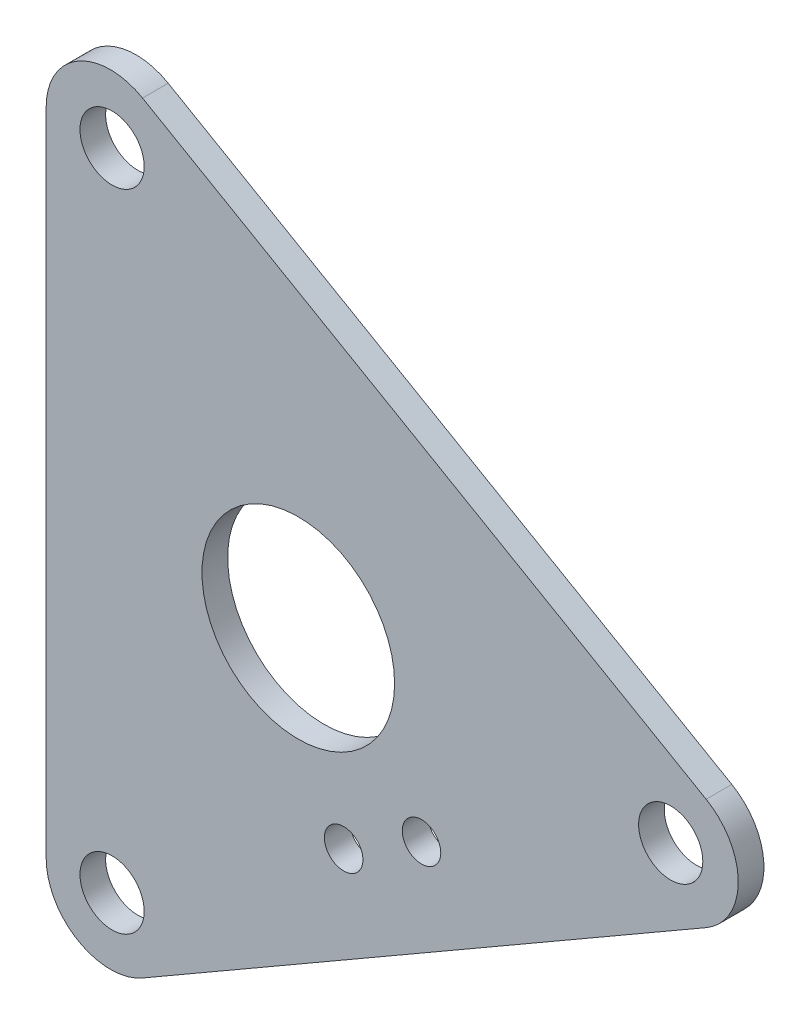
ISO-10303-21;
HEADER;
FILE_DESCRIPTION(('STEP AP214'),'2;1');
FILE_NAME('part.step','',(''),(''),'','','');
FILE_SCHEMA(('AUTOMOTIVE_DESIGN { 1 0 10303 214 1 1 1 1 }'));
ENDSEC;
DATA;
#1=APPLICATION_CONTEXT('core data for automotive mechanical design processes');
#2=APPLICATION_PROTOCOL_DEFINITION('international standard','automotive_design',2000,#1);
#3=PRODUCT_CONTEXT('',#1,'mechanical');
#4=PRODUCT('Part','Part','',(#3));
#5=PRODUCT_RELATED_PRODUCT_CATEGORY('part','',(#4));
#6=PRODUCT_DEFINITION_FORMATION('','',#4);
#7=PRODUCT_DEFINITION_CONTEXT('part definition',#1,'design');
#8=PRODUCT_DEFINITION('design','',#6,#7);
#9=PRODUCT_DEFINITION_SHAPE('','',#8);
#10=(LENGTH_UNIT() NAMED_UNIT(*) SI_UNIT(.MILLI.,.METRE.));
#11=(NAMED_UNIT(*) PLANE_ANGLE_UNIT() SI_UNIT($,.RADIAN.));
#12=(NAMED_UNIT(*) SI_UNIT($,.STERADIAN.) SOLID_ANGLE_UNIT());
#13=UNCERTAINTY_MEASURE_WITH_UNIT(LENGTH_MEASURE(1.E-05),#10,'distance_accuracy_value','');
#14=(GEOMETRIC_REPRESENTATION_CONTEXT(3) GLOBAL_UNCERTAINTY_ASSIGNED_CONTEXT((#13)) GLOBAL_UNIT_ASSIGNED_CONTEXT((#10,
#11,#12)) REPRESENTATION_CONTEXT('',''));
#15=CARTESIAN_POINT('',(0.,0.,0.));
#16=DIRECTION('',(0.,0.,1.));
#17=DIRECTION('',(1.,0.,0.));
#18=AXIS2_PLACEMENT_3D('',#15,#16,#17);
#19=CARTESIAN_POINT('',(-19.6299091524473,-34.,2.));
#20=DIRECTION('',(-0.5,0.866025403784439,0.));
#21=DIRECTION('',(-0.866025403784439,-0.5,0.));
#22=AXIS2_PLACEMENT_3D('',#19,#20,#21);
#23=PLANE('',#22);
#24=DIRECTION('',(0.866025403784439,0.5,0.));
#25=VECTOR('',#24,1.);
#26=CARTESIAN_POINT('',(-19.6299091524473,-34.,0.));
#27=LINE('',#26,#25);
#28=CARTESIAN_POINT('',(-12.1299091524473,-29.6698729810778,0.));
#29=VERTEX_POINT('',#28);
#30=CARTESIAN_POINT('',(31.7598183048945,-4.33012701892219,0.));
#31=VERTEX_POINT('',#30);
#32=EDGE_CURVE('E112',#29,#31,#27,.T.);
#33=ORIENTED_EDGE('',*,*,#32,.T.);
#34=DIRECTION('',(0.,0.,-1.));
#35=VECTOR('',#34,1.);
#36=CARTESIAN_POINT('',(31.7598183048945,-4.33012701892219,2.));
#37=LINE('',#36,#35);
#38=CARTESIAN_POINT('',(31.7598183048945,-4.33012701892219,2.));
#39=VERTEX_POINT('',#38);
#40=EDGE_CURVE('E91',#31,#39,#37,.F.);
#41=ORIENTED_EDGE('',*,*,#40,.T.);
#42=DIRECTION('',(0.866025403784439,0.5,0.));
#43=VECTOR('',#42,1.);
#44=CARTESIAN_POINT('',(-19.6299091524473,-34.,2.));
#45=LINE('',#44,#43);
#46=CARTESIAN_POINT('',(-12.1299091524473,-29.6698729810778,2.));
#47=VERTEX_POINT('',#46);
#48=EDGE_CURVE('E114',#47,#39,#45,.T.);
#49=ORIENTED_EDGE('',*,*,#48,.F.);
#50=DIRECTION('',(0.,0.,-1.));
#51=VECTOR('',#50,1.);
#52=CARTESIAN_POINT('',(-12.1299091524473,-29.6698729810778,2.));
#53=LINE('',#52,#51);
#54=EDGE_CURVE('E96',#47,#29,#53,.T.);
#55=ORIENTED_EDGE('',*,*,#54,.T.);
#56=EDGE_LOOP('',(#33,#41,#49,#55));
#57=FACE_BOUND('',#56,.T.);
#58=ADVANCED_FACE('F33',(#57),#23,.F.);
#59=CARTESIAN_POINT('',(39.2598183048945,0.,2.));
#60=DIRECTION('',(-0.5,-0.866025403784439,0.));
#61=DIRECTION('',(0.866025403784439,-0.5,0.));
#62=AXIS2_PLACEMENT_3D('',#59,#60,#61);
#63=PLANE('',#62);
#64=DIRECTION('',(-0.866025403784439,0.5,0.));
#65=VECTOR('',#64,1.);
#66=CARTESIAN_POINT('',(39.2598183048945,0.,2.));
#67=LINE('',#66,#65);
#68=CARTESIAN_POINT('',(31.7598183048945,4.33012701892219,2.));
#69=VERTEX_POINT('',#68);
#70=CARTESIAN_POINT('',(-12.1299091524473,29.6698729810778,2.));
#71=VERTEX_POINT('',#70);
#72=EDGE_CURVE('E105',#69,#71,#67,.T.);
#73=ORIENTED_EDGE('',*,*,#72,.F.);
#74=DIRECTION('',(0.,0.,-1.));
#75=VECTOR('',#74,1.);
#76=CARTESIAN_POINT('',(31.7598183048945,4.33012701892219,2.));
#77=LINE('',#76,#75);
#78=CARTESIAN_POINT('',(31.7598183048945,4.33012701892219,0.));
#79=VERTEX_POINT('',#78);
#80=EDGE_CURVE('E90',#69,#79,#77,.T.);
#81=ORIENTED_EDGE('',*,*,#80,.T.);
#82=DIRECTION('',(-0.866025403784439,0.5,0.));
#83=VECTOR('',#82,1.);
#84=CARTESIAN_POINT('',(39.2598183048945,0.,0.));
#85=LINE('',#84,#83);
#86=CARTESIAN_POINT('',(-12.1299091524473,29.6698729810778,0.));
#87=VERTEX_POINT('',#86);
#88=EDGE_CURVE('E103',#79,#87,#85,.T.);
#89=ORIENTED_EDGE('',*,*,#88,.T.);
#90=DIRECTION('',(0.,0.,-1.));
#91=VECTOR('',#90,1.);
#92=CARTESIAN_POINT('',(-12.1299091524473,29.6698729810778,2.));
#93=LINE('',#92,#91);
#94=EDGE_CURVE('E107',#87,#71,#93,.F.);
#95=ORIENTED_EDGE('',*,*,#94,.T.);
#96=EDGE_LOOP('',(#73,#81,#89,#95));
#97=FACE_BOUND('',#96,.T.);
#98=ADVANCED_FACE('F102',(#97),#63,.F.);
#99=CARTESIAN_POINT('',(-19.6299091524473,34.,2.));
#100=DIRECTION('',(1.,0.,0.));
#101=DIRECTION('',(0.,1.,0.));
#102=AXIS2_PLACEMENT_3D('',#99,#100,#101);
#103=PLANE('',#102);
#104=DIRECTION('',(0.,-1.,0.));
#105=VECTOR('',#104,1.);
#106=CARTESIAN_POINT('',(-19.6299091524473,34.,0.));
#107=LINE('',#106,#105);
#108=CARTESIAN_POINT('',(-19.6299091524473,25.3397459621556,0.));
#109=VERTEX_POINT('',#108);
#110=CARTESIAN_POINT('',(-19.6299091524473,-25.3397459621556,0.));
#111=VERTEX_POINT('',#110);
#112=EDGE_CURVE('E111',#109,#111,#107,.T.);
#113=ORIENTED_EDGE('',*,*,#112,.T.);
#114=DIRECTION('',(0.,0.,-1.));
#115=VECTOR('',#114,1.);
#116=CARTESIAN_POINT('',(-19.6299091524473,-25.3397459621556,2.));
#117=LINE('',#116,#115);
#118=CARTESIAN_POINT('',(-19.6299091524473,-25.3397459621556,2.));
#119=VERTEX_POINT('',#118);
#120=EDGE_CURVE('E11',#111,#119,#117,.F.);
#121=ORIENTED_EDGE('',*,*,#120,.T.);
#122=DIRECTION('',(0.,-1.,0.));
#123=VECTOR('',#122,1.);
#124=CARTESIAN_POINT('',(-19.6299091524473,34.,2.));
#125=LINE('',#124,#123);
#126=CARTESIAN_POINT('',(-19.6299091524473,25.3397459621556,2.));
#127=VERTEX_POINT('',#126);
#128=EDGE_CURVE('E120',#127,#119,#125,.T.);
#129=ORIENTED_EDGE('',*,*,#128,.F.);
#130=DIRECTION('',(0.,0.,-1.));
#131=VECTOR('',#130,1.);
#132=CARTESIAN_POINT('',(-19.6299091524473,25.3397459621556,2.));
#133=LINE('',#132,#131);
#134=EDGE_CURVE('E41',#127,#109,#133,.T.);
#135=ORIENTED_EDGE('',*,*,#134,.T.);
#136=EDGE_LOOP('',(#113,#121,#129,#135));
#137=FACE_BOUND('',#136,.T.);
#138=ADVANCED_FACE('F133',(#137),#103,.F.);
#139=CARTESIAN_POINT('',(0.,0.,2.));
#140=DIRECTION('',(0.,0.,1.));
#141=DIRECTION('',(1.,0.,0.));
#142=AXIS2_PLACEMENT_3D('',#139,#140,#141);
#143=PLANE('',#142);
#144=CARTESIAN_POINT('',(9.59604348946919,-9.62083487540114,2.));
#145=DIRECTION('',(0.,0.,1.));
#146=DIRECTION('',(1.,0.,0.));
#147=AXIS2_PLACEMENT_3D('',#144,#145,#146);
#148=CIRCLE('',#147,1.5);
#149=CARTESIAN_POINT('',(11.0960434894692,-9.62083487540114,2.));
#150=VERTEX_POINT('',#149);
#151=EDGE_CURVE('E236',#150,#150,#148,.T.);
#152=ORIENTED_EDGE('',*,*,#151,.F.);
#153=EDGE_LOOP('',(#152));
#154=FACE_BOUND('',#153,.T.);
#155=CARTESIAN_POINT('',(3.53386566297813,-13.1208348754011,2.));
#156=DIRECTION('',(0.,0.,1.));
#157=DIRECTION('',(1.,0.,0.));
#158=AXIS2_PLACEMENT_3D('',#155,#156,#157);
#159=CIRCLE('',#158,1.5);
#160=CARTESIAN_POINT('',(5.03386566297813,-13.1208348754011,2.));
#161=VERTEX_POINT('',#160);
#162=EDGE_CURVE('E224',#161,#161,#159,.T.);
#163=ORIENTED_EDGE('',*,*,#162,.F.);
#164=EDGE_LOOP('',(#163));
#165=FACE_BOUND('',#164,.T.);
#166=CARTESIAN_POINT('',(-14.5,-25.1147367097487,2.));
#167=DIRECTION('',(0.,0.,1.));
#168=DIRECTION('',(1.,0.,0.));
#169=AXIS2_PLACEMENT_3D('',#166,#167,#168);
#170=CIRCLE('',#169,2.5);
#171=CARTESIAN_POINT('',(-12.,-25.1147367097487,2.));
#172=VERTEX_POINT('',#171);
#173=EDGE_CURVE('E227',#172,#172,#170,.T.);
#174=ORIENTED_EDGE('',*,*,#173,.F.);
#175=EDGE_LOOP('',(#174));
#176=FACE_BOUND('',#175,.T.);
#177=CARTESIAN_POINT('',(-14.5,25.1147367097487,2.));
#178=DIRECTION('',(0.,0.,1.));
#179=DIRECTION('',(1.,0.,0.));
#180=AXIS2_PLACEMENT_3D('',#177,#178,#179);
#181=CIRCLE('',#180,2.5);
#182=CARTESIAN_POINT('',(-12.,25.1147367097487,2.));
#183=VERTEX_POINT('',#182);
#184=EDGE_CURVE('E220',#183,#183,#181,.T.);
#185=ORIENTED_EDGE('',*,*,#184,.F.);
#186=EDGE_LOOP('',(#185));
#187=FACE_BOUND('',#186,.T.);
#188=CARTESIAN_POINT('',(29.,0.,2.));
#189=DIRECTION('',(0.,0.,1.));
#190=DIRECTION('',(1.,0.,0.));
#191=AXIS2_PLACEMENT_3D('',#188,#189,#190);
#192=CIRCLE('',#191,2.5);
#193=CARTESIAN_POINT('',(31.5,0.,2.));
#194=VERTEX_POINT('',#193);
#195=EDGE_CURVE('E212',#194,#194,#192,.T.);
#196=ORIENTED_EDGE('',*,*,#195,.F.);
#197=EDGE_LOOP('',(#196));
#198=FACE_BOUND('',#197,.T.);
#199=CARTESIAN_POINT('',(0.,0.,2.));
#200=DIRECTION('',(0.,0.,1.));
#201=DIRECTION('',(1.,0.,0.));
#202=AXIS2_PLACEMENT_3D('',#199,#200,#201);
#203=CIRCLE('',#202,7.5);
#204=CARTESIAN_POINT('',(7.5,0.,2.));
#205=VERTEX_POINT('',#204);
#206=EDGE_CURVE('E145',#205,#205,#203,.T.);
#207=ORIENTED_EDGE('',*,*,#206,.F.);
#208=EDGE_LOOP('',(#207));
#209=FACE_BOUND('',#208,.T.);
#210=ORIENTED_EDGE('',*,*,#48,.T.);
#211=CARTESIAN_POINT('',(29.2598183048945,0.,2.));
#212=DIRECTION('',(0.,0.,1.));
#213=DIRECTION('',(1.,0.,0.));
#214=AXIS2_PLACEMENT_3D('',#211,#212,#213);
#215=CIRCLE('',#214,5.);
#216=EDGE_CURVE('E130',#39,#69,#215,.T.);
#217=ORIENTED_EDGE('',*,*,#216,.T.);
#218=ORIENTED_EDGE('',*,*,#72,.T.);
#219=CARTESIAN_POINT('',(-14.6299091524473,25.3397459621556,2.));
#220=DIRECTION('',(0.,0.,1.));
#221=DIRECTION('',(1.,0.,0.));
#222=AXIS2_PLACEMENT_3D('',#219,#220,#221);
#223=CIRCLE('',#222,5.);
#224=EDGE_CURVE('E53',#71,#127,#223,.T.);
#225=ORIENTED_EDGE('',*,*,#224,.T.);
#226=ORIENTED_EDGE('',*,*,#128,.T.);
#227=CARTESIAN_POINT('',(-14.6299091524473,-25.3397459621556,2.));
#228=DIRECTION('',(0.,0.,1.));
#229=DIRECTION('',(1.,0.,0.));
#230=AXIS2_PLACEMENT_3D('',#227,#228,#229);
#231=CIRCLE('',#230,5.);
#232=EDGE_CURVE('E128',#119,#47,#231,.T.);
#233=ORIENTED_EDGE('',*,*,#232,.T.);
#234=EDGE_LOOP('',(#210,#217,#218,#225,#226,#233));
#235=FACE_BOUND('',#234,.T.);
#236=ADVANCED_FACE('F147',(#154,#165,#176,#187,#198,#209,#235),#143,.T.);
#237=CARTESIAN_POINT('',(0.,0.,0.));
#238=DIRECTION('',(0.,0.,1.));
#239=DIRECTION('',(1.,0.,0.));
#240=AXIS2_PLACEMENT_3D('',#237,#238,#239);
#241=PLANE('',#240);
#242=CARTESIAN_POINT('',(9.59604348946919,-9.62083487540114,0.));
#243=DIRECTION('',(0.,0.,-1.));
#244=DIRECTION('',(-1.,0.,0.));
#245=AXIS2_PLACEMENT_3D('',#242,#243,#244);
#246=CIRCLE('',#245,1.5);
#247=CARTESIAN_POINT('',(8.09604348946919,-9.62083487540114,0.));
#248=VERTEX_POINT('',#247);
#249=EDGE_CURVE('E239',#248,#248,#246,.T.);
#250=ORIENTED_EDGE('',*,*,#249,.F.);
#251=EDGE_LOOP('',(#250));
#252=FACE_BOUND('',#251,.T.);
#253=CARTESIAN_POINT('',(3.53386566297813,-13.1208348754011,0.));
#254=DIRECTION('',(0.,0.,-1.));
#255=DIRECTION('',(1.,0.,0.));
#256=AXIS2_PLACEMENT_3D('',#253,#254,#255);
#257=CIRCLE('',#256,1.5);
#258=CARTESIAN_POINT('',(5.03386566297813,-13.1208348754011,0.));
#259=VERTEX_POINT('',#258);
#260=EDGE_CURVE('E233',#259,#259,#257,.T.);
#261=ORIENTED_EDGE('',*,*,#260,.F.);
#262=EDGE_LOOP('',(#261));
#263=FACE_BOUND('',#262,.T.);
#264=CARTESIAN_POINT('',(-14.5,-25.1147367097487,0.));
#265=DIRECTION('',(0.,0.,1.));
#266=DIRECTION('',(1.,0.,0.));
#267=AXIS2_PLACEMENT_3D('',#264,#265,#266);
#268=CIRCLE('',#267,2.5);
#269=CARTESIAN_POINT('',(-12.,-25.1147367097487,0.));
#270=VERTEX_POINT('',#269);
#271=EDGE_CURVE('E217',#270,#270,#268,.T.);
#272=ORIENTED_EDGE('',*,*,#271,.T.);
#273=EDGE_LOOP('',(#272));
#274=FACE_BOUND('',#273,.T.);
#275=CARTESIAN_POINT('',(-14.5,25.1147367097487,0.));
#276=DIRECTION('',(0.,0.,1.));
#277=DIRECTION('',(1.,0.,0.));
#278=AXIS2_PLACEMENT_3D('',#275,#276,#277);
#279=CIRCLE('',#278,2.5);
#280=CARTESIAN_POINT('',(-12.,25.1147367097487,0.));
#281=VERTEX_POINT('',#280);
#282=EDGE_CURVE('E223',#281,#281,#279,.T.);
#283=ORIENTED_EDGE('',*,*,#282,.T.);
#284=EDGE_LOOP('',(#283));
#285=FACE_BOUND('',#284,.T.);
#286=CARTESIAN_POINT('',(29.,0.,0.));
#287=DIRECTION('',(0.,0.,1.));
#288=DIRECTION('',(1.,0.,0.));
#289=AXIS2_PLACEMENT_3D('',#286,#287,#288);
#290=CIRCLE('',#289,2.5);
#291=CARTESIAN_POINT('',(31.5,0.,0.));
#292=VERTEX_POINT('',#291);
#293=EDGE_CURVE('E210',#292,#292,#290,.T.);
#294=ORIENTED_EDGE('',*,*,#293,.T.);
#295=EDGE_LOOP('',(#294));
#296=FACE_BOUND('',#295,.T.);
#297=CARTESIAN_POINT('',(0.,0.,0.));
#298=DIRECTION('',(0.,0.,1.));
#299=DIRECTION('',(1.,0.,0.));
#300=AXIS2_PLACEMENT_3D('',#297,#298,#299);
#301=CIRCLE('',#300,7.5);
#302=CARTESIAN_POINT('',(7.5,0.,0.));
#303=VERTEX_POINT('',#302);
#304=EDGE_CURVE('E116',#303,#303,#301,.T.);
#305=ORIENTED_EDGE('',*,*,#304,.T.);
#306=EDGE_LOOP('',(#305));
#307=FACE_BOUND('',#306,.T.);
#308=ORIENTED_EDGE('',*,*,#88,.F.);
#309=CARTESIAN_POINT('',(29.2598183048945,0.,0.));
#310=DIRECTION('',(0.,0.,1.));
#311=DIRECTION('',(1.,0.,0.));
#312=AXIS2_PLACEMENT_3D('',#309,#310,#311);
#313=CIRCLE('',#312,5.);
#314=EDGE_CURVE('E86',#79,#31,#313,.F.);
#315=ORIENTED_EDGE('',*,*,#314,.T.);
#316=ORIENTED_EDGE('',*,*,#32,.F.);
#317=CARTESIAN_POINT('',(-14.6299091524473,-25.3397459621556,0.));
#318=DIRECTION('',(0.,0.,1.));
#319=DIRECTION('',(1.,0.,0.));
#320=AXIS2_PLACEMENT_3D('',#317,#318,#319);
#321=CIRCLE('',#320,5.);
#322=EDGE_CURVE('E97',#29,#111,#321,.F.);
#323=ORIENTED_EDGE('',*,*,#322,.T.);
#324=ORIENTED_EDGE('',*,*,#112,.F.);
#325=CARTESIAN_POINT('',(-14.6299091524473,25.3397459621556,0.));
#326=DIRECTION('',(0.,0.,1.));
#327=DIRECTION('',(1.,0.,0.));
#328=AXIS2_PLACEMENT_3D('',#325,#326,#327);
#329=CIRCLE('',#328,5.);
#330=EDGE_CURVE('E106',#109,#87,#329,.F.);
#331=ORIENTED_EDGE('',*,*,#330,.T.);
#332=EDGE_LOOP('',(#308,#315,#316,#323,#324,#331));
#333=FACE_BOUND('',#332,.T.);
#334=ADVANCED_FACE('F109',(#252,#263,#274,#285,#296,#307,#333),#241,.F.);
#335=CARTESIAN_POINT('',(0.,0.,0.));
#336=DIRECTION('',(0.,0.,1.));
#337=DIRECTION('',(1.,0.,0.));
#338=AXIS2_PLACEMENT_3D('',#335,#336,#337);
#339=CYLINDRICAL_SURFACE('',#338,7.5);
#340=ORIENTED_EDGE('',*,*,#304,.F.);
#341=EDGE_LOOP('',(#340));
#342=FACE_BOUND('',#341,.T.);
#343=ORIENTED_EDGE('',*,*,#206,.T.);
#344=EDGE_LOOP('',(#343));
#345=FACE_BOUND('',#344,.T.);
#346=ADVANCED_FACE('F155',(#342,#345),#339,.F.);
#347=CARTESIAN_POINT('',(29.,0.,0.));
#348=DIRECTION('',(0.,0.,1.));
#349=DIRECTION('',(1.,0.,0.));
#350=AXIS2_PLACEMENT_3D('',#347,#348,#349);
#351=CYLINDRICAL_SURFACE('',#350,2.5);
#352=ORIENTED_EDGE('',*,*,#293,.F.);
#353=EDGE_LOOP('',(#352));
#354=FACE_BOUND('',#353,.T.);
#355=ORIENTED_EDGE('',*,*,#195,.T.);
#356=EDGE_LOOP('',(#355));
#357=FACE_BOUND('',#356,.T.);
#358=ADVANCED_FACE('F196',(#354,#357),#351,.F.);
#359=CARTESIAN_POINT('',(-14.5,25.1147367097487,0.));
#360=DIRECTION('',(0.,0.,1.));
#361=DIRECTION('',(1.,0.,0.));
#362=AXIS2_PLACEMENT_3D('',#359,#360,#361);
#363=CYLINDRICAL_SURFACE('',#362,2.5);
#364=ORIENTED_EDGE('',*,*,#282,.F.);
#365=EDGE_LOOP('',(#364));
#366=FACE_BOUND('',#365,.T.);
#367=ORIENTED_EDGE('',*,*,#184,.T.);
#368=EDGE_LOOP('',(#367));
#369=FACE_BOUND('',#368,.T.);
#370=ADVANCED_FACE('F192',(#366,#369),#363,.F.);
#371=CARTESIAN_POINT('',(-14.5,-25.1147367097487,0.));
#372=DIRECTION('',(0.,0.,1.));
#373=DIRECTION('',(1.,0.,0.));
#374=AXIS2_PLACEMENT_3D('',#371,#372,#373);
#375=CYLINDRICAL_SURFACE('',#374,2.5);
#376=ORIENTED_EDGE('',*,*,#271,.F.);
#377=EDGE_LOOP('',(#376));
#378=FACE_BOUND('',#377,.T.);
#379=ORIENTED_EDGE('',*,*,#173,.T.);
#380=EDGE_LOOP('',(#379));
#381=FACE_BOUND('',#380,.T.);
#382=ADVANCED_FACE('F170',(#378,#381),#375,.F.);
#383=CARTESIAN_POINT('',(29.2598183048945,0.,2.));
#384=DIRECTION('',(0.,0.,-1.));
#385=DIRECTION('',(-1.,0.,0.));
#386=AXIS2_PLACEMENT_3D('',#383,#384,#385);
#387=CYLINDRICAL_SURFACE('',#386,5.);
#388=ORIENTED_EDGE('',*,*,#216,.F.);
#389=ORIENTED_EDGE('',*,*,#40,.F.);
#390=ORIENTED_EDGE('',*,*,#314,.F.);
#391=ORIENTED_EDGE('',*,*,#80,.F.);
#392=EDGE_LOOP('',(#388,#389,#390,#391));
#393=FACE_BOUND('',#392,.T.);
#394=ADVANCED_FACE('F89',(#393),#387,.T.);
#395=CARTESIAN_POINT('',(-14.6299091524473,-25.3397459621556,2.));
#396=DIRECTION('',(0.,0.,-1.));
#397=DIRECTION('',(-1.,0.,0.));
#398=AXIS2_PLACEMENT_3D('',#395,#396,#397);
#399=CYLINDRICAL_SURFACE('',#398,5.);
#400=ORIENTED_EDGE('',*,*,#232,.F.);
#401=ORIENTED_EDGE('',*,*,#120,.F.);
#402=ORIENTED_EDGE('',*,*,#322,.F.);
#403=ORIENTED_EDGE('',*,*,#54,.F.);
#404=EDGE_LOOP('',(#400,#401,#402,#403));
#405=FACE_BOUND('',#404,.T.);
#406=ADVANCED_FACE('F138',(#405),#399,.T.);
#407=CARTESIAN_POINT('',(-14.6299091524473,25.3397459621556,2.));
#408=DIRECTION('',(0.,0.,-1.));
#409=DIRECTION('',(-1.,0.,0.));
#410=AXIS2_PLACEMENT_3D('',#407,#408,#409);
#411=CYLINDRICAL_SURFACE('',#410,5.);
#412=ORIENTED_EDGE('',*,*,#224,.F.);
#413=ORIENTED_EDGE('',*,*,#94,.F.);
#414=ORIENTED_EDGE('',*,*,#330,.F.);
#415=ORIENTED_EDGE('',*,*,#134,.F.);
#416=EDGE_LOOP('',(#412,#413,#414,#415));
#417=FACE_BOUND('',#416,.T.);
#418=ADVANCED_FACE('F35',(#417),#411,.T.);
#419=CARTESIAN_POINT('',(3.53386566297813,-13.1208348754011,3.));
#420=DIRECTION('',(0.,0.,-1.));
#421=DIRECTION('',(-1.,0.,0.));
#422=AXIS2_PLACEMENT_3D('',#419,#420,#421);
#423=CYLINDRICAL_SURFACE('',#422,1.5);
#424=ORIENTED_EDGE('',*,*,#162,.T.);
#425=EDGE_LOOP('',(#424));
#426=FACE_BOUND('',#425,.T.);
#427=ORIENTED_EDGE('',*,*,#260,.T.);
#428=EDGE_LOOP('',(#427));
#429=FACE_BOUND('',#428,.T.);
#430=ADVANCED_FACE('F175',(#426,#429),#423,.F.);
#431=CARTESIAN_POINT('',(9.59604348946919,-9.62083487540114,3.));
#432=DIRECTION('',(0.,0.,-1.));
#433=DIRECTION('',(-1.,0.,0.));
#434=AXIS2_PLACEMENT_3D('',#431,#432,#433);
#435=CYLINDRICAL_SURFACE('',#434,1.5);
#436=ORIENTED_EDGE('',*,*,#151,.T.);
#437=EDGE_LOOP('',(#436));
#438=FACE_BOUND('',#437,.T.);
#439=ORIENTED_EDGE('',*,*,#249,.T.);
#440=EDGE_LOOP('',(#439));
#441=FACE_BOUND('',#440,.T.);
#442=ADVANCED_FACE('F179',(#438,#441),#435,.F.);
#443=CLOSED_SHELL('',(#58,#98,#138,#236,#334,#346,#358,#370,#382,#394,#406,#418,#430,#442));
#444=MANIFOLD_SOLID_BREP('B2',#443);
#445=ADVANCED_BREP_SHAPE_REPRESENTATION('',(#18,#444),#14);
#446=SHAPE_DEFINITION_REPRESENTATION(#9,#445);
ENDSEC;
END-ISO-10303-21;
